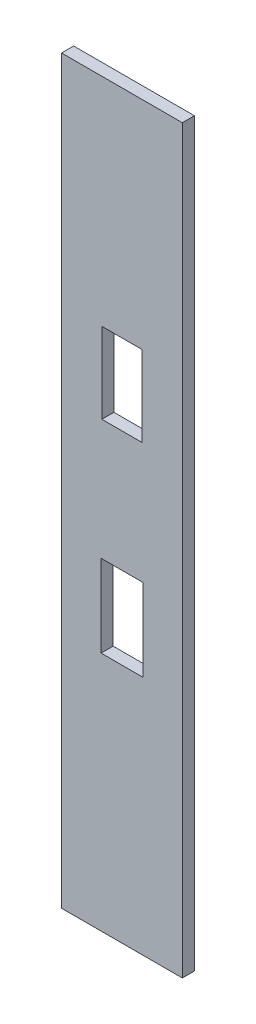
ISO-10303-21;
HEADER;
FILE_DESCRIPTION(('STEP AP214'),'2;1');
FILE_NAME('part.step','',(''),(''),'','','');
FILE_SCHEMA(('AUTOMOTIVE_DESIGN { 1 0 10303 214 1 1 1 1 }'));
ENDSEC;
DATA;
#1=APPLICATION_CONTEXT('core data for automotive mechanical design processes');
#2=APPLICATION_PROTOCOL_DEFINITION('international standard','automotive_design',2000,#1);
#3=PRODUCT_CONTEXT('',#1,'mechanical');
#4=PRODUCT('Part','Part','',(#3));
#5=PRODUCT_RELATED_PRODUCT_CATEGORY('part','',(#4));
#6=PRODUCT_DEFINITION_FORMATION('','',#4);
#7=PRODUCT_DEFINITION_CONTEXT('part definition',#1,'design');
#8=PRODUCT_DEFINITION('design','',#6,#7);
#9=PRODUCT_DEFINITION_SHAPE('','',#8);
#10=(LENGTH_UNIT() NAMED_UNIT(*) SI_UNIT(.MILLI.,.METRE.));
#11=(NAMED_UNIT(*) PLANE_ANGLE_UNIT() SI_UNIT($,.RADIAN.));
#12=(NAMED_UNIT(*) SI_UNIT($,.STERADIAN.) SOLID_ANGLE_UNIT());
#13=UNCERTAINTY_MEASURE_WITH_UNIT(LENGTH_MEASURE(1.E-05),#10,'distance_accuracy_value','');
#14=(GEOMETRIC_REPRESENTATION_CONTEXT(3) GLOBAL_UNCERTAINTY_ASSIGNED_CONTEXT((#13)) GLOBAL_UNIT_ASSIGNED_CONTEXT((#10,
#11,#12)) REPRESENTATION_CONTEXT('',''));
#15=CARTESIAN_POINT('',(0.,0.,0.));
#16=DIRECTION('',(0.,0.,1.));
#17=DIRECTION('',(1.,0.,0.));
#18=AXIS2_PLACEMENT_3D('',#15,#16,#17);
#19=CARTESIAN_POINT('',(-75.,-460.,15.));
#20=DIRECTION('',(1.,0.,0.));
#21=DIRECTION('',(0.,0.,-1.));
#22=AXIS2_PLACEMENT_3D('',#19,#20,#21);
#23=PLANE('',#22);
#24=DIRECTION('',(0.,-1.,0.));
#25=VECTOR('',#24,1.);
#26=CARTESIAN_POINT('',(-75.,-460.,0.));
#27=LINE('',#26,#25);
#28=CARTESIAN_POINT('',(-75.,460.,0.));
#29=VERTEX_POINT('',#28);
#30=CARTESIAN_POINT('',(-75.,-460.,0.));
#31=VERTEX_POINT('',#30);
#32=EDGE_CURVE('E181',#29,#31,#27,.T.);
#33=ORIENTED_EDGE('',*,*,#32,.T.);
#34=DIRECTION('',(0.,0.,-1.));
#35=VECTOR('',#34,1.);
#36=CARTESIAN_POINT('',(-75.,-460.,15.));
#37=LINE('',#36,#35);
#38=CARTESIAN_POINT('',(-75.,-460.,15.));
#39=VERTEX_POINT('',#38);
#40=EDGE_CURVE('E209',#39,#31,#37,.T.);
#41=ORIENTED_EDGE('',*,*,#40,.F.);
#42=DIRECTION('',(0.,-1.,0.));
#43=VECTOR('',#42,1.);
#44=CARTESIAN_POINT('',(-75.,-460.,15.));
#45=LINE('',#44,#43);
#46=CARTESIAN_POINT('',(-75.,460.,15.));
#47=VERTEX_POINT('',#46);
#48=EDGE_CURVE('E184',#47,#39,#45,.T.);
#49=ORIENTED_EDGE('',*,*,#48,.F.);
#50=DIRECTION('',(0.,0.,-1.));
#51=VECTOR('',#50,1.);
#52=CARTESIAN_POINT('',(-75.,460.,15.));
#53=LINE('',#52,#51);
#54=EDGE_CURVE('E193',#47,#29,#53,.T.);
#55=ORIENTED_EDGE('',*,*,#54,.T.);
#56=EDGE_LOOP('',(#33,#41,#49,#55));
#57=FACE_BOUND('',#56,.T.);
#58=ADVANCED_FACE('F39',(#57),#23,.F.);
#59=CARTESIAN_POINT('',(75.,-460.,15.));
#60=DIRECTION('',(0.,1.,0.));
#61=DIRECTION('',(-1.,0.,0.));
#62=AXIS2_PLACEMENT_3D('',#59,#60,#61);
#63=PLANE('',#62);
#64=DIRECTION('',(1.,0.,0.));
#65=VECTOR('',#64,1.);
#66=CARTESIAN_POINT('',(75.,-460.,0.));
#67=LINE('',#66,#65);
#68=CARTESIAN_POINT('',(75.,-460.,0.));
#69=VERTEX_POINT('',#68);
#70=EDGE_CURVE('E197',#31,#69,#67,.T.);
#71=ORIENTED_EDGE('',*,*,#70,.T.);
#72=DIRECTION('',(0.,0.,-1.));
#73=VECTOR('',#72,1.);
#74=CARTESIAN_POINT('',(75.,-460.,15.));
#75=LINE('',#74,#73);
#76=CARTESIAN_POINT('',(75.,-460.,15.));
#77=VERTEX_POINT('',#76);
#78=EDGE_CURVE('E210',#77,#69,#75,.T.);
#79=ORIENTED_EDGE('',*,*,#78,.F.);
#80=DIRECTION('',(1.,0.,0.));
#81=VECTOR('',#80,1.);
#82=CARTESIAN_POINT('',(75.,-460.,15.));
#83=LINE('',#82,#81);
#84=EDGE_CURVE('E190',#39,#77,#83,.T.);
#85=ORIENTED_EDGE('',*,*,#84,.F.);
#86=ORIENTED_EDGE('',*,*,#40,.T.);
#87=EDGE_LOOP('',(#71,#79,#85,#86));
#88=FACE_BOUND('',#87,.T.);
#89=ADVANCED_FACE('F253',(#88),#63,.F.);
#90=CARTESIAN_POINT('',(75.,-460.,15.));
#91=DIRECTION('',(-1.,0.,0.));
#92=DIRECTION('',(0.,0.,1.));
#93=AXIS2_PLACEMENT_3D('',#90,#91,#92);
#94=PLANE('',#93);
#95=DIRECTION('',(0.,1.,0.));
#96=VECTOR('',#95,1.);
#97=CARTESIAN_POINT('',(75.,-460.,0.));
#98=LINE('',#97,#96);
#99=CARTESIAN_POINT('',(75.,460.,0.));
#100=VERTEX_POINT('',#99);
#101=EDGE_CURVE('E200',#69,#100,#98,.T.);
#102=ORIENTED_EDGE('',*,*,#101,.T.);
#103=DIRECTION('',(0.,0.,-1.));
#104=VECTOR('',#103,1.);
#105=CARTESIAN_POINT('',(75.,460.,15.));
#106=LINE('',#105,#104);
#107=CARTESIAN_POINT('',(75.,460.,15.));
#108=VERTEX_POINT('',#107);
#109=EDGE_CURVE('E204',#108,#100,#106,.T.);
#110=ORIENTED_EDGE('',*,*,#109,.F.);
#111=DIRECTION('',(0.,1.,0.));
#112=VECTOR('',#111,1.);
#113=CARTESIAN_POINT('',(75.,-460.,15.));
#114=LINE('',#113,#112);
#115=EDGE_CURVE('E189',#77,#108,#114,.T.);
#116=ORIENTED_EDGE('',*,*,#115,.F.);
#117=ORIENTED_EDGE('',*,*,#78,.T.);
#118=EDGE_LOOP('',(#102,#110,#116,#117));
#119=FACE_BOUND('',#118,.T.);
#120=ADVANCED_FACE('F258',(#119),#94,.F.);
#121=CARTESIAN_POINT('',(75.,460.,15.));
#122=DIRECTION('',(0.,-1.,0.));
#123=DIRECTION('',(0.,0.,-1.));
#124=AXIS2_PLACEMENT_3D('',#121,#122,#123);
#125=PLANE('',#124);
#126=DIRECTION('',(-1.,0.,0.));
#127=VECTOR('',#126,1.);
#128=CARTESIAN_POINT('',(75.,460.,0.));
#129=LINE('',#128,#127);
#130=EDGE_CURVE('E187',#100,#29,#129,.T.);
#131=ORIENTED_EDGE('',*,*,#130,.T.);
#132=ORIENTED_EDGE('',*,*,#54,.F.);
#133=DIRECTION('',(-1.,0.,0.));
#134=VECTOR('',#133,1.);
#135=CARTESIAN_POINT('',(75.,460.,15.));
#136=LINE('',#135,#134);
#137=EDGE_CURVE('E191',#108,#47,#136,.T.);
#138=ORIENTED_EDGE('',*,*,#137,.F.);
#139=ORIENTED_EDGE('',*,*,#109,.T.);
#140=EDGE_LOOP('',(#131,#132,#138,#139));
#141=FACE_BOUND('',#140,.T.);
#142=ADVANCED_FACE('F267',(#141),#125,.F.);
#143=CARTESIAN_POINT('',(0.,0.,15.));
#144=DIRECTION('',(0.,0.,1.));
#145=DIRECTION('',(1.,0.,0.));
#146=AXIS2_PLACEMENT_3D('',#143,#144,#145);
#147=PLANE('',#146);
#148=DIRECTION('',(0.,1.,0.));
#149=VECTOR('',#148,1.);
#150=CARTESIAN_POINT('',(-25.,191.,15.));
#151=LINE('',#150,#149);
#152=CARTESIAN_POINT('',(-25.,90.9999999999999,15.));
#153=VERTEX_POINT('',#152);
#154=CARTESIAN_POINT('',(-25.,191.,15.));
#155=VERTEX_POINT('',#154);
#156=EDGE_CURVE('E129',#153,#155,#151,.T.);
#157=ORIENTED_EDGE('',*,*,#156,.T.);
#158=DIRECTION('',(1.,0.,0.));
#159=VECTOR('',#158,1.);
#160=CARTESIAN_POINT('',(25.,191.,15.));
#161=LINE('',#160,#159);
#162=CARTESIAN_POINT('',(25.,191.,15.));
#163=VERTEX_POINT('',#162);
#164=EDGE_CURVE('E140',#155,#163,#161,.T.);
#165=ORIENTED_EDGE('',*,*,#164,.T.);
#166=DIRECTION('',(0.,-1.,0.));
#167=VECTOR('',#166,1.);
#168=CARTESIAN_POINT('',(25.,191.,15.));
#169=LINE('',#168,#167);
#170=CARTESIAN_POINT('',(25.,90.9999999999999,15.));
#171=VERTEX_POINT('',#170);
#172=EDGE_CURVE('E52',#163,#171,#169,.T.);
#173=ORIENTED_EDGE('',*,*,#172,.T.);
#174=DIRECTION('',(-1.,0.,0.));
#175=VECTOR('',#174,1.);
#176=CARTESIAN_POINT('',(25.,90.9999999999999,15.));
#177=LINE('',#176,#175);
#178=EDGE_CURVE('E134',#171,#153,#177,.T.);
#179=ORIENTED_EDGE('',*,*,#178,.T.);
#180=EDGE_LOOP('',(#157,#165,#173,#179));
#181=FACE_BOUND('',#180,.T.);
#182=DIRECTION('',(0.,1.,0.));
#183=VECTOR('',#182,1.);
#184=CARTESIAN_POINT('',(26.,0.,15.));
#185=LINE('',#184,#183);
#186=CARTESIAN_POINT('',(26.,-161.,15.));
#187=VERTEX_POINT('',#186);
#188=CARTESIAN_POINT('',(26.,-59.0000000000001,15.));
#189=VERTEX_POINT('',#188);
#190=EDGE_CURVE('E182',#187,#189,#185,.T.);
#191=ORIENTED_EDGE('',*,*,#190,.F.);
#192=DIRECTION('',(1.,0.,0.));
#193=VECTOR('',#192,1.);
#194=CARTESIAN_POINT('',(0.,-161.,15.));
#195=LINE('',#194,#193);
#196=CARTESIAN_POINT('',(-26.,-161.,15.));
#197=VERTEX_POINT('',#196);
#198=EDGE_CURVE('E170',#197,#187,#195,.T.);
#199=ORIENTED_EDGE('',*,*,#198,.F.);
#200=DIRECTION('',(0.,-1.,0.));
#201=VECTOR('',#200,1.);
#202=CARTESIAN_POINT('',(-26.,0.,15.));
#203=LINE('',#202,#201);
#204=CARTESIAN_POINT('',(-26.,-59.0000000000001,15.));
#205=VERTEX_POINT('',#204);
#206=EDGE_CURVE('E179',#205,#197,#203,.T.);
#207=ORIENTED_EDGE('',*,*,#206,.F.);
#208=DIRECTION('',(-1.,0.,0.));
#209=VECTOR('',#208,1.);
#210=CARTESIAN_POINT('',(0.,-59.0000000000001,15.));
#211=LINE('',#210,#209);
#212=EDGE_CURVE('E178',#189,#205,#211,.T.);
#213=ORIENTED_EDGE('',*,*,#212,.F.);
#214=EDGE_LOOP('',(#191,#199,#207,#213));
#215=FACE_BOUND('',#214,.T.);
#216=ORIENTED_EDGE('',*,*,#48,.T.);
#217=ORIENTED_EDGE('',*,*,#84,.T.);
#218=ORIENTED_EDGE('',*,*,#115,.T.);
#219=ORIENTED_EDGE('',*,*,#137,.T.);
#220=EDGE_LOOP('',(#216,#217,#218,#219));
#221=FACE_BOUND('',#220,.T.);
#222=ADVANCED_FACE('F142',(#181,#215,#221),#147,.T.);
#223=CARTESIAN_POINT('',(0.,0.,0.));
#224=DIRECTION('',(0.,0.,1.));
#225=DIRECTION('',(1.,0.,0.));
#226=AXIS2_PLACEMENT_3D('',#223,#224,#225);
#227=PLANE('',#226);
#228=DIRECTION('',(1.,0.,0.));
#229=VECTOR('',#228,1.);
#230=CARTESIAN_POINT('',(25.,191.,0.));
#231=LINE('',#230,#229);
#232=CARTESIAN_POINT('',(-25.,191.,0.));
#233=VERTEX_POINT('',#232);
#234=CARTESIAN_POINT('',(25.,191.,0.));
#235=VERTEX_POINT('',#234);
#236=EDGE_CURVE('E152',#233,#235,#231,.T.);
#237=ORIENTED_EDGE('',*,*,#236,.F.);
#238=DIRECTION('',(0.,1.,0.));
#239=VECTOR('',#238,1.);
#240=CARTESIAN_POINT('',(-25.,191.,0.));
#241=LINE('',#240,#239);
#242=CARTESIAN_POINT('',(-25.,90.9999999999999,0.));
#243=VERTEX_POINT('',#242);
#244=EDGE_CURVE('E61',#243,#233,#241,.T.);
#245=ORIENTED_EDGE('',*,*,#244,.F.);
#246=DIRECTION('',(-1.,0.,0.));
#247=VECTOR('',#246,1.);
#248=CARTESIAN_POINT('',(25.,90.9999999999999,0.));
#249=LINE('',#248,#247);
#250=CARTESIAN_POINT('',(25.,90.9999999999999,0.));
#251=VERTEX_POINT('',#250);
#252=EDGE_CURVE('E144',#251,#243,#249,.T.);
#253=ORIENTED_EDGE('',*,*,#252,.F.);
#254=DIRECTION('',(0.,-1.,0.));
#255=VECTOR('',#254,1.);
#256=CARTESIAN_POINT('',(25.,191.,0.));
#257=LINE('',#256,#255);
#258=EDGE_CURVE('E146',#235,#251,#257,.T.);
#259=ORIENTED_EDGE('',*,*,#258,.F.);
#260=EDGE_LOOP('',(#237,#245,#253,#259));
#261=FACE_BOUND('',#260,.T.);
#262=DIRECTION('',(1.,0.,0.));
#263=VECTOR('',#262,1.);
#264=CARTESIAN_POINT('',(0.,-161.,0.));
#265=LINE('',#264,#263);
#266=CARTESIAN_POINT('',(-26.,-161.,0.));
#267=VERTEX_POINT('',#266);
#268=CARTESIAN_POINT('',(26.,-161.,0.));
#269=VERTEX_POINT('',#268);
#270=EDGE_CURVE('E213',#267,#269,#265,.T.);
#271=ORIENTED_EDGE('',*,*,#270,.T.);
#272=DIRECTION('',(0.,1.,0.));
#273=VECTOR('',#272,1.);
#274=CARTESIAN_POINT('',(26.,0.,0.));
#275=LINE('',#274,#273);
#276=CARTESIAN_POINT('',(26.,-59.0000000000001,0.));
#277=VERTEX_POINT('',#276);
#278=EDGE_CURVE('E11',#269,#277,#275,.T.);
#279=ORIENTED_EDGE('',*,*,#278,.T.);
#280=DIRECTION('',(-1.,0.,0.));
#281=VECTOR('',#280,1.);
#282=CARTESIAN_POINT('',(0.,-59.0000000000001,0.));
#283=LINE('',#282,#281);
#284=CARTESIAN_POINT('',(-26.,-59.0000000000001,0.));
#285=VERTEX_POINT('',#284);
#286=EDGE_CURVE('E46',#277,#285,#283,.T.);
#287=ORIENTED_EDGE('',*,*,#286,.T.);
#288=DIRECTION('',(0.,-1.,0.));
#289=VECTOR('',#288,1.);
#290=CARTESIAN_POINT('',(-26.,0.,0.));
#291=LINE('',#290,#289);
#292=EDGE_CURVE('E216',#285,#267,#291,.T.);
#293=ORIENTED_EDGE('',*,*,#292,.T.);
#294=EDGE_LOOP('',(#271,#279,#287,#293));
#295=FACE_BOUND('',#294,.T.);
#296=ORIENTED_EDGE('',*,*,#32,.F.);
#297=ORIENTED_EDGE('',*,*,#130,.F.);
#298=ORIENTED_EDGE('',*,*,#101,.F.);
#299=ORIENTED_EDGE('',*,*,#70,.F.);
#300=EDGE_LOOP('',(#296,#297,#298,#299));
#301=FACE_BOUND('',#300,.T.);
#302=ADVANCED_FACE('F219',(#261,#295,#301),#227,.F.);
#303=CARTESIAN_POINT('',(26.,-161.,200.));
#304=DIRECTION('',(1.,0.,0.));
#305=DIRECTION('',(0.,0.,-1.));
#306=AXIS2_PLACEMENT_3D('',#303,#304,#305);
#307=PLANE('',#306);
#308=ORIENTED_EDGE('',*,*,#190,.T.);
#309=DIRECTION('',(0.,0.,-1.));
#310=VECTOR('',#309,1.);
#311=CARTESIAN_POINT('',(26.,-59.0000000000001,200.));
#312=LINE('',#311,#310);
#313=EDGE_CURVE('E163',#189,#277,#312,.T.);
#314=ORIENTED_EDGE('',*,*,#313,.T.);
#315=ORIENTED_EDGE('',*,*,#278,.F.);
#316=DIRECTION('',(0.,0.,-1.));
#317=VECTOR('',#316,1.);
#318=CARTESIAN_POINT('',(26.,-161.,200.));
#319=LINE('',#318,#317);
#320=EDGE_CURVE('E159',#187,#269,#319,.T.);
#321=ORIENTED_EDGE('',*,*,#320,.F.);
#322=EDGE_LOOP('',(#308,#314,#315,#321));
#323=FACE_BOUND('',#322,.T.);
#324=ADVANCED_FACE('F228',(#323),#307,.F.);
#325=CARTESIAN_POINT('',(-26.,-59.0000000000001,200.));
#326=DIRECTION('',(0.,1.,0.));
#327=DIRECTION('',(0.,0.,1.));
#328=AXIS2_PLACEMENT_3D('',#325,#326,#327);
#329=PLANE('',#328);
#330=ORIENTED_EDGE('',*,*,#212,.T.);
#331=DIRECTION('',(0.,0.,-1.));
#332=VECTOR('',#331,1.);
#333=CARTESIAN_POINT('',(-26.,-59.0000000000001,200.));
#334=LINE('',#333,#332);
#335=EDGE_CURVE('E169',#205,#285,#334,.T.);
#336=ORIENTED_EDGE('',*,*,#335,.T.);
#337=ORIENTED_EDGE('',*,*,#286,.F.);
#338=ORIENTED_EDGE('',*,*,#313,.F.);
#339=EDGE_LOOP('',(#330,#336,#337,#338));
#340=FACE_BOUND('',#339,.T.);
#341=ADVANCED_FACE('F223',(#340),#329,.F.);
#342=CARTESIAN_POINT('',(-26.,-161.,200.));
#343=DIRECTION('',(-1.,0.,0.));
#344=DIRECTION('',(0.,0.,1.));
#345=AXIS2_PLACEMENT_3D('',#342,#343,#344);
#346=PLANE('',#345);
#347=ORIENTED_EDGE('',*,*,#206,.T.);
#348=DIRECTION('',(0.,0.,-1.));
#349=VECTOR('',#348,1.);
#350=CARTESIAN_POINT('',(-26.,-161.,200.));
#351=LINE('',#350,#349);
#352=EDGE_CURVE('E171',#197,#267,#351,.T.);
#353=ORIENTED_EDGE('',*,*,#352,.T.);
#354=ORIENTED_EDGE('',*,*,#292,.F.);
#355=ORIENTED_EDGE('',*,*,#335,.F.);
#356=EDGE_LOOP('',(#347,#353,#354,#355));
#357=FACE_BOUND('',#356,.T.);
#358=ADVANCED_FACE('F237',(#357),#346,.F.);
#359=CARTESIAN_POINT('',(-26.,-161.,200.));
#360=DIRECTION('',(0.,-1.,0.));
#361=DIRECTION('',(0.,0.,-1.));
#362=AXIS2_PLACEMENT_3D('',#359,#360,#361);
#363=PLANE('',#362);
#364=ORIENTED_EDGE('',*,*,#198,.T.);
#365=ORIENTED_EDGE('',*,*,#320,.T.);
#366=ORIENTED_EDGE('',*,*,#270,.F.);
#367=ORIENTED_EDGE('',*,*,#352,.F.);
#368=EDGE_LOOP('',(#364,#365,#366,#367));
#369=FACE_BOUND('',#368,.T.);
#370=ADVANCED_FACE('F236',(#369),#363,.F.);
#371=CARTESIAN_POINT('',(-25.,191.,15.));
#372=DIRECTION('',(-1.,0.,0.));
#373=DIRECTION('',(0.,-1.,0.));
#374=AXIS2_PLACEMENT_3D('',#371,#372,#373);
#375=PLANE('',#374);
#376=ORIENTED_EDGE('',*,*,#244,.T.);
#377=DIRECTION('',(0.,0.,-1.));
#378=VECTOR('',#377,1.);
#379=CARTESIAN_POINT('',(-25.,191.,15.));
#380=LINE('',#379,#378);
#381=EDGE_CURVE('E122',#155,#233,#380,.T.);
#382=ORIENTED_EDGE('',*,*,#381,.F.);
#383=ORIENTED_EDGE('',*,*,#156,.F.);
#384=DIRECTION('',(0.,0.,-1.));
#385=VECTOR('',#384,1.);
#386=CARTESIAN_POINT('',(-25.,90.9999999999999,15.));
#387=LINE('',#386,#385);
#388=EDGE_CURVE('E158',#153,#243,#387,.T.);
#389=ORIENTED_EDGE('',*,*,#388,.T.);
#390=EDGE_LOOP('',(#376,#382,#383,#389));
#391=FACE_BOUND('',#390,.T.);
#392=ADVANCED_FACE('F130',(#391),#375,.F.);
#393=CARTESIAN_POINT('',(25.,90.9999999999999,15.));
#394=DIRECTION('',(0.,-1.,0.));
#395=DIRECTION('',(0.,0.,-1.));
#396=AXIS2_PLACEMENT_3D('',#393,#394,#395);
#397=PLANE('',#396);
#398=ORIENTED_EDGE('',*,*,#252,.T.);
#399=ORIENTED_EDGE('',*,*,#388,.F.);
#400=ORIENTED_EDGE('',*,*,#178,.F.);
#401=DIRECTION('',(0.,0.,-1.));
#402=VECTOR('',#401,1.);
#403=CARTESIAN_POINT('',(25.,90.9999999999999,15.));
#404=LINE('',#403,#402);
#405=EDGE_CURVE('E161',#171,#251,#404,.T.);
#406=ORIENTED_EDGE('',*,*,#405,.T.);
#407=EDGE_LOOP('',(#398,#399,#400,#406));
#408=FACE_BOUND('',#407,.T.);
#409=ADVANCED_FACE('F249',(#408),#397,.F.);
#410=CARTESIAN_POINT('',(25.,191.,15.));
#411=DIRECTION('',(1.,0.,0.));
#412=DIRECTION('',(0.,1.,0.));
#413=AXIS2_PLACEMENT_3D('',#410,#411,#412);
#414=PLANE('',#413);
#415=ORIENTED_EDGE('',*,*,#258,.T.);
#416=ORIENTED_EDGE('',*,*,#405,.F.);
#417=ORIENTED_EDGE('',*,*,#172,.F.);
#418=DIRECTION('',(0.,0.,-1.));
#419=VECTOR('',#418,1.);
#420=CARTESIAN_POINT('',(25.,191.,15.));
#421=LINE('',#420,#419);
#422=EDGE_CURVE('E133',#163,#235,#421,.T.);
#423=ORIENTED_EDGE('',*,*,#422,.T.);
#424=EDGE_LOOP('',(#415,#416,#417,#423));
#425=FACE_BOUND('',#424,.T.);
#426=ADVANCED_FACE('F292',(#425),#414,.F.);
#427=CARTESIAN_POINT('',(25.,191.,15.));
#428=DIRECTION('',(0.,1.,0.));
#429=DIRECTION('',(0.,0.,1.));
#430=AXIS2_PLACEMENT_3D('',#427,#428,#429);
#431=PLANE('',#430);
#432=ORIENTED_EDGE('',*,*,#236,.T.);
#433=ORIENTED_EDGE('',*,*,#422,.F.);
#434=ORIENTED_EDGE('',*,*,#164,.F.);
#435=ORIENTED_EDGE('',*,*,#381,.T.);
#436=EDGE_LOOP('',(#432,#433,#434,#435));
#437=FACE_BOUND('',#436,.T.);
#438=ADVANCED_FACE('F138',(#437),#431,.F.);
#439=CLOSED_SHELL('',(#58,#89,#120,#142,#222,#302,#324,#341,#358,#370,#392,#409,#426,#438));
#440=MANIFOLD_SOLID_BREP('B2',#439);
#441=ADVANCED_BREP_SHAPE_REPRESENTATION('',(#18,#440),#14);
#442=SHAPE_DEFINITION_REPRESENTATION(#9,#441);
ENDSEC;
END-ISO-10303-21;
